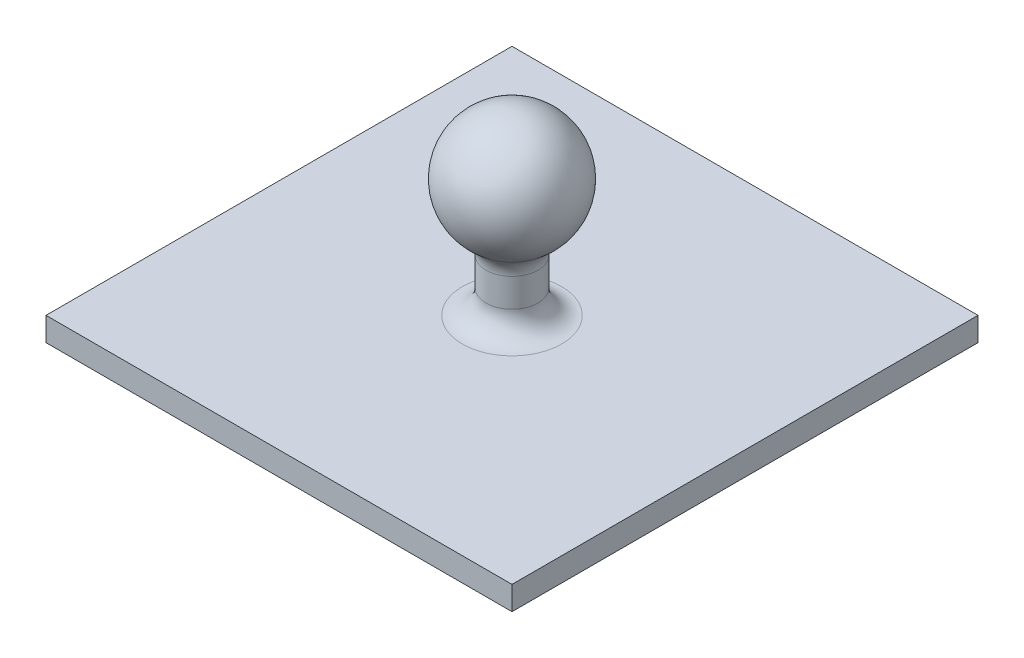
ISO-10303-21;
HEADER;
FILE_DESCRIPTION(('STEP AP214'),'2;1');
FILE_NAME('part.step','',(''),(''),'','','');
FILE_SCHEMA(('AUTOMOTIVE_DESIGN { 1 0 10303 214 1 1 1 1 }'));
ENDSEC;
DATA;
#1=APPLICATION_CONTEXT('core data for automotive mechanical design processes');
#2=APPLICATION_PROTOCOL_DEFINITION('international standard','automotive_design',2000,#1);
#3=PRODUCT_CONTEXT('',#1,'mechanical');
#4=PRODUCT('Part','Part','',(#3));
#5=PRODUCT_RELATED_PRODUCT_CATEGORY('part','',(#4));
#6=PRODUCT_DEFINITION_FORMATION('','',#4);
#7=PRODUCT_DEFINITION_CONTEXT('part definition',#1,'design');
#8=PRODUCT_DEFINITION('design','',#6,#7);
#9=PRODUCT_DEFINITION_SHAPE('','',#8);
#10=(LENGTH_UNIT() NAMED_UNIT(*) SI_UNIT(.MILLI.,.METRE.));
#11=(NAMED_UNIT(*) PLANE_ANGLE_UNIT() SI_UNIT($,.RADIAN.));
#12=(NAMED_UNIT(*) SI_UNIT($,.STERADIAN.) SOLID_ANGLE_UNIT());
#13=UNCERTAINTY_MEASURE_WITH_UNIT(LENGTH_MEASURE(1.E-05),#10,'distance_accuracy_value','');
#14=(GEOMETRIC_REPRESENTATION_CONTEXT(3) GLOBAL_UNCERTAINTY_ASSIGNED_CONTEXT((#13)) GLOBAL_UNIT_ASSIGNED_CONTEXT((#10,
#11,#12)) REPRESENTATION_CONTEXT('',''));
#15=CARTESIAN_POINT('',(0.,0.,0.));
#16=DIRECTION('',(0.,0.,1.));
#17=DIRECTION('',(1.,0.,0.));
#18=AXIS2_PLACEMENT_3D('',#15,#16,#17);
#19=CARTESIAN_POINT('',(50.,30.48,-50.));
#20=DIRECTION('',(0.,-1.,0.));
#21=DIRECTION('',(0.,0.,-1.));
#22=AXIS2_PLACEMENT_3D('',#19,#20,#21);
#23=CYLINDRICAL_SURFACE('',#22,5.58799999999999);
#24=CARTESIAN_POINT('',(50.,16.256,-50.));
#25=DIRECTION('',(0.,1.,0.));
#26=DIRECTION('',(0.,0.,1.));
#27=AXIS2_PLACEMENT_3D('',#24,#25,#26);
#28=CIRCLE('',#27,5.58799999999999);
#29=CARTESIAN_POINT('',(50.,16.256,-44.412));
#30=VERTEX_POINT('',#29);
#31=EDGE_CURVE('E49',#30,#30,#28,.F.);
#32=ORIENTED_EDGE('',*,*,#31,.T.);
#33=EDGE_LOOP('',(#32));
#34=FACE_BOUND('',#33,.T.);
#35=CARTESIAN_POINT('',(50.,10.16,-50.));
#36=DIRECTION('',(0.,-1.,0.));
#37=DIRECTION('',(0.,0.,-1.));
#38=AXIS2_PLACEMENT_3D('',#35,#36,#37);
#39=CIRCLE('',#38,5.58799999999999);
#40=CARTESIAN_POINT('',(50.,10.16,-55.588));
#41=VERTEX_POINT('',#40);
#42=EDGE_CURVE('E132',#41,#41,#39,.F.);
#43=ORIENTED_EDGE('',*,*,#42,.T.);
#44=EDGE_LOOP('',(#43));
#45=FACE_BOUND('',#44,.T.);
#46=ADVANCED_FACE('F39',(#34,#45),#23,.T.);
#47=CARTESIAN_POINT('',(0.,5.08,0.));
#48=DIRECTION('',(1.,0.,0.));
#49=DIRECTION('',(0.,0.,-1.));
#50=AXIS2_PLACEMENT_3D('',#47,#48,#49);
#51=PLANE('',#50);
#52=DIRECTION('',(0.,0.,1.));
#53=VECTOR('',#52,1.);
#54=CARTESIAN_POINT('',(0.,0.,0.));
#55=LINE('',#54,#53);
#56=CARTESIAN_POINT('',(0.,0.,-100.));
#57=VERTEX_POINT('',#56);
#58=CARTESIAN_POINT('',(0.,0.,0.));
#59=VERTEX_POINT('',#58);
#60=EDGE_CURVE('E112',#57,#59,#55,.T.);
#61=ORIENTED_EDGE('',*,*,#60,.T.);
#62=DIRECTION('',(0.,-1.,0.));
#63=VECTOR('',#62,1.);
#64=CARTESIAN_POINT('',(0.,5.08,0.));
#65=LINE('',#64,#63);
#66=CARTESIAN_POINT('',(0.,5.08,0.));
#67=VERTEX_POINT('',#66);
#68=EDGE_CURVE('E101',#67,#59,#65,.T.);
#69=ORIENTED_EDGE('',*,*,#68,.F.);
#70=DIRECTION('',(0.,0.,1.));
#71=VECTOR('',#70,1.);
#72=CARTESIAN_POINT('',(0.,5.08,0.));
#73=LINE('',#72,#71);
#74=CARTESIAN_POINT('',(0.,5.08,-100.));
#75=VERTEX_POINT('',#74);
#76=EDGE_CURVE('E93',#75,#67,#73,.T.);
#77=ORIENTED_EDGE('',*,*,#76,.F.);
#78=DIRECTION('',(0.,-1.,0.));
#79=VECTOR('',#78,1.);
#80=CARTESIAN_POINT('',(0.,5.08,-100.));
#81=LINE('',#80,#79);
#82=EDGE_CURVE('E108',#75,#57,#81,.T.);
#83=ORIENTED_EDGE('',*,*,#82,.T.);
#84=EDGE_LOOP('',(#61,#69,#77,#83));
#85=FACE_BOUND('',#84,.T.);
#86=ADVANCED_FACE('F157',(#85),#51,.F.);
#87=CARTESIAN_POINT('',(0.,5.08,0.));
#88=DIRECTION('',(0.,0.,-1.));
#89=DIRECTION('',(-1.,0.,0.));
#90=AXIS2_PLACEMENT_3D('',#87,#88,#89);
#91=PLANE('',#90);
#92=DIRECTION('',(1.,0.,0.));
#93=VECTOR('',#92,1.);
#94=CARTESIAN_POINT('',(0.,0.,0.));
#95=LINE('',#94,#93);
#96=CARTESIAN_POINT('',(100.,0.,0.));
#97=VERTEX_POINT('',#96);
#98=EDGE_CURVE('E99',#59,#97,#95,.T.);
#99=ORIENTED_EDGE('',*,*,#98,.T.);
#100=DIRECTION('',(0.,-1.,0.));
#101=VECTOR('',#100,1.);
#102=CARTESIAN_POINT('',(100.,5.08,0.));
#103=LINE('',#102,#101);
#104=CARTESIAN_POINT('',(100.,5.08,0.));
#105=VERTEX_POINT('',#104);
#106=EDGE_CURVE('E97',#105,#97,#103,.T.);
#107=ORIENTED_EDGE('',*,*,#106,.F.);
#108=DIRECTION('',(1.,0.,0.));
#109=VECTOR('',#108,1.);
#110=CARTESIAN_POINT('',(0.,5.08,0.));
#111=LINE('',#110,#109);
#112=EDGE_CURVE('E88',#67,#105,#111,.T.);
#113=ORIENTED_EDGE('',*,*,#112,.F.);
#114=ORIENTED_EDGE('',*,*,#68,.T.);
#115=EDGE_LOOP('',(#99,#107,#113,#114));
#116=FACE_BOUND('',#115,.T.);
#117=ADVANCED_FACE('F98',(#116),#91,.F.);
#118=CARTESIAN_POINT('',(100.,5.08,0.));
#119=DIRECTION('',(-1.,0.,0.));
#120=DIRECTION('',(0.,0.,1.));
#121=AXIS2_PLACEMENT_3D('',#118,#119,#120);
#122=PLANE('',#121);
#123=DIRECTION('',(0.,0.,-1.));
#124=VECTOR('',#123,1.);
#125=CARTESIAN_POINT('',(100.,0.,0.));
#126=LINE('',#125,#124);
#127=CARTESIAN_POINT('',(100.,0.,-100.));
#128=VERTEX_POINT('',#127);
#129=EDGE_CURVE('E74',#97,#128,#126,.T.);
#130=ORIENTED_EDGE('',*,*,#129,.T.);
#131=DIRECTION('',(0.,-1.,0.));
#132=VECTOR('',#131,1.);
#133=CARTESIAN_POINT('',(100.,5.08,-100.));
#134=LINE('',#133,#132);
#135=CARTESIAN_POINT('',(100.,5.08,-100.));
#136=VERTEX_POINT('',#135);
#137=EDGE_CURVE('E102',#136,#128,#134,.T.);
#138=ORIENTED_EDGE('',*,*,#137,.F.);
#139=DIRECTION('',(0.,0.,-1.));
#140=VECTOR('',#139,1.);
#141=CARTESIAN_POINT('',(100.,5.08,0.));
#142=LINE('',#141,#140);
#143=EDGE_CURVE('E91',#105,#136,#142,.T.);
#144=ORIENTED_EDGE('',*,*,#143,.F.);
#145=ORIENTED_EDGE('',*,*,#106,.T.);
#146=EDGE_LOOP('',(#130,#138,#144,#145));
#147=FACE_BOUND('',#146,.T.);
#148=ADVANCED_FACE('F104',(#147),#122,.F.);
#149=CARTESIAN_POINT('',(0.,5.08,-100.));
#150=DIRECTION('',(0.,0.,1.));
#151=DIRECTION('',(1.,0.,0.));
#152=AXIS2_PLACEMENT_3D('',#149,#150,#151);
#153=PLANE('',#152);
#154=DIRECTION('',(-1.,0.,0.));
#155=VECTOR('',#154,1.);
#156=CARTESIAN_POINT('',(0.,0.,-100.));
#157=LINE('',#156,#155);
#158=EDGE_CURVE('E80',#128,#57,#157,.T.);
#159=ORIENTED_EDGE('',*,*,#158,.T.);
#160=ORIENTED_EDGE('',*,*,#82,.F.);
#161=DIRECTION('',(-1.,0.,0.));
#162=VECTOR('',#161,1.);
#163=CARTESIAN_POINT('',(0.,5.08,-100.));
#164=LINE('',#163,#162);
#165=EDGE_CURVE('E57',#136,#75,#164,.T.);
#166=ORIENTED_EDGE('',*,*,#165,.F.);
#167=ORIENTED_EDGE('',*,*,#137,.T.);
#168=EDGE_LOOP('',(#159,#160,#166,#167));
#169=FACE_BOUND('',#168,.T.);
#170=ADVANCED_FACE('F165',(#169),#153,.F.);
#171=CARTESIAN_POINT('',(0.,5.08,0.));
#172=DIRECTION('',(0.,-1.,0.));
#173=DIRECTION('',(0.,0.,-1.));
#174=AXIS2_PLACEMENT_3D('',#171,#172,#173);
#175=PLANE('',#174);
#176=CARTESIAN_POINT('',(50.,5.08,-50.));
#177=DIRECTION('',(0.,-1.,0.));
#178=DIRECTION('',(0.,0.,-1.));
#179=AXIS2_PLACEMENT_3D('',#176,#177,#178);
#180=CIRCLE('',#179,10.668);
#181=CARTESIAN_POINT('',(50.,5.08,-60.668));
#182=VERTEX_POINT('',#181);
#183=EDGE_CURVE('E11',#182,#182,#180,.T.);
#184=ORIENTED_EDGE('',*,*,#183,.T.);
#185=EDGE_LOOP('',(#184));
#186=FACE_BOUND('',#185,.T.);
#187=ORIENTED_EDGE('',*,*,#76,.T.);
#188=ORIENTED_EDGE('',*,*,#112,.T.);
#189=ORIENTED_EDGE('',*,*,#143,.T.);
#190=ORIENTED_EDGE('',*,*,#165,.T.);
#191=EDGE_LOOP('',(#187,#188,#189,#190));
#192=FACE_BOUND('',#191,.T.);
#193=ADVANCED_FACE('F89',(#186,#192),#175,.F.);
#194=CARTESIAN_POINT('',(0.,0.,0.));
#195=DIRECTION('',(0.,-1.,0.));
#196=DIRECTION('',(0.,0.,-1.));
#197=AXIS2_PLACEMENT_3D('',#194,#195,#196);
#198=PLANE('',#197);
#199=ORIENTED_EDGE('',*,*,#60,.F.);
#200=ORIENTED_EDGE('',*,*,#158,.F.);
#201=ORIENTED_EDGE('',*,*,#129,.F.);
#202=ORIENTED_EDGE('',*,*,#98,.F.);
#203=EDGE_LOOP('',(#199,#200,#201,#202));
#204=FACE_BOUND('',#203,.T.);
#205=ADVANCED_FACE('F148',(#204),#198,.T.);
#206=CARTESIAN_POINT('',(50.,30.48,-50.));
#207=DIRECTION('',(0.,0.,-1.));
#208=DIRECTION('',(1.,0.,0.));
#209=AXIS2_PLACEMENT_3D('',#206,#207,#208);
#210=SPHERICAL_SURFACE('',#209,12.7);
#211=CARTESIAN_POINT('',(50.,30.48,-50.));
#212=DIRECTION('',(0.,1.,0.));
#213=DIRECTION('',(0.,0.,1.));
#214=AXIS2_PLACEMENT_3D('',#211,#212,#213);
#215=SPHERICAL_SURFACE('',#214,12.7);
#216=CARTESIAN_POINT('',(50.,20.32,-50.));
#217=DIRECTION('',(0.,1.,0.));
#218=DIRECTION('',(0.,0.,1.));
#219=AXIS2_PLACEMENT_3D('',#216,#217,#218);
#220=CIRCLE('',#219,7.62);
#221=CARTESIAN_POINT('',(50.,20.32,-42.38));
#222=VERTEX_POINT('',#221);
#223=EDGE_CURVE('E128',#222,#222,#220,.T.);
#224=ORIENTED_EDGE('',*,*,#223,.T.);
#225=EDGE_LOOP('',(#224));
#226=FACE_BOUND('',#225,.T.);
#227=ADVANCED_FACE('F144',(#226),#215,.T.);
#228=CARTESIAN_POINT('',(50.,16.256,-50.));
#229=DIRECTION('',(0.,1.,0.));
#230=DIRECTION('',(0.,0.,1.));
#231=AXIS2_PLACEMENT_3D('',#228,#229,#230);
#232=TOROIDAL_SURFACE('',#231,10.668,5.08);
#233=ORIENTED_EDGE('',*,*,#31,.F.);
#234=EDGE_LOOP('',(#233));
#235=FACE_BOUND('',#234,.T.);
#236=ORIENTED_EDGE('',*,*,#223,.F.);
#237=EDGE_LOOP('',(#236));
#238=FACE_BOUND('',#237,.T.);
#239=ADVANCED_FACE('F141',(#235,#238),#232,.F.);
#240=CARTESIAN_POINT('',(50.,10.16,-50.));
#241=DIRECTION('',(0.,-1.,0.));
#242=DIRECTION('',(0.,0.,-1.));
#243=AXIS2_PLACEMENT_3D('',#240,#241,#242);
#244=TOROIDAL_SURFACE('',#243,10.668,5.08);
#245=ORIENTED_EDGE('',*,*,#183,.F.);
#246=EDGE_LOOP('',(#245));
#247=FACE_BOUND('',#246,.T.);
#248=ORIENTED_EDGE('',*,*,#42,.F.);
#249=EDGE_LOOP('',(#248));
#250=FACE_BOUND('',#249,.T.);
#251=ADVANCED_FACE('F41',(#247,#250),#244,.F.);
#252=CLOSED_SHELL('',(#46,#86,#117,#148,#170,#193,#205,#227,#239,#251));
#253=MANIFOLD_SOLID_BREP('B2',#252);
#254=ADVANCED_BREP_SHAPE_REPRESENTATION('',(#18,#253),#14);
#255=SHAPE_DEFINITION_REPRESENTATION(#9,#254);
ENDSEC;
END-ISO-10303-21;
